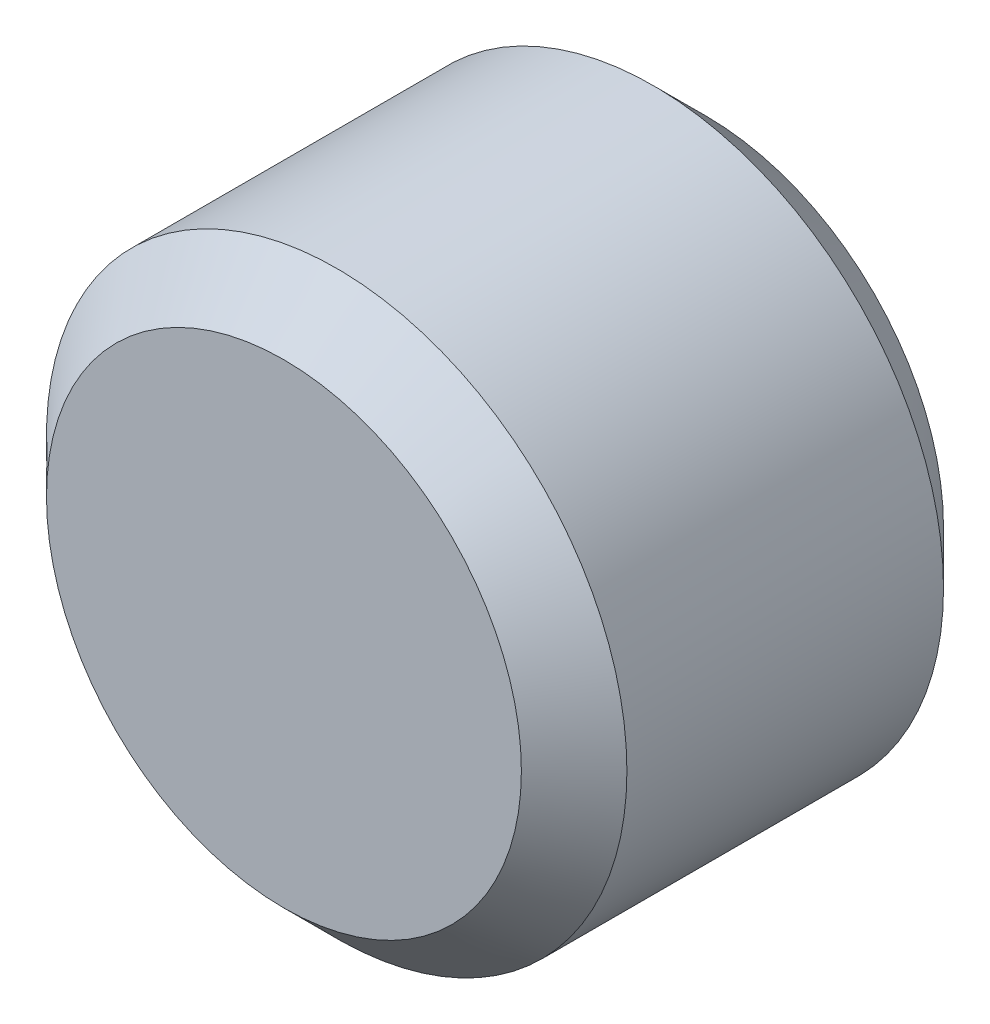
ISO-10303-21;
HEADER;
FILE_DESCRIPTION(('STEP AP214'),'2;1');
FILE_NAME('part.step','',(''),(''),'','','');
FILE_SCHEMA(('AUTOMOTIVE_DESIGN { 1 0 10303 214 1 1 1 1 }'));
ENDSEC;
DATA;
#1=APPLICATION_CONTEXT('core data for automotive mechanical design processes');
#2=APPLICATION_PROTOCOL_DEFINITION('international standard','automotive_design',2000,#1);
#3=PRODUCT_CONTEXT('',#1,'mechanical');
#4=PRODUCT('Part','Part','',(#3));
#5=PRODUCT_RELATED_PRODUCT_CATEGORY('part','',(#4));
#6=PRODUCT_DEFINITION_FORMATION('','',#4);
#7=PRODUCT_DEFINITION_CONTEXT('part definition',#1,'design');
#8=PRODUCT_DEFINITION('design','',#6,#7);
#9=PRODUCT_DEFINITION_SHAPE('','',#8);
#10=(LENGTH_UNIT() NAMED_UNIT(*) SI_UNIT(.MILLI.,.METRE.));
#11=(NAMED_UNIT(*) PLANE_ANGLE_UNIT() SI_UNIT($,.RADIAN.));
#12=(NAMED_UNIT(*) SI_UNIT($,.STERADIAN.) SOLID_ANGLE_UNIT());
#13=UNCERTAINTY_MEASURE_WITH_UNIT(LENGTH_MEASURE(1.E-05),#10,'distance_accuracy_value','');
#14=(GEOMETRIC_REPRESENTATION_CONTEXT(3) GLOBAL_UNCERTAINTY_ASSIGNED_CONTEXT((#13)) GLOBAL_UNIT_ASSIGNED_CONTEXT((#10,
#11,#12)) REPRESENTATION_CONTEXT('',''));
#15=CARTESIAN_POINT('',(0.,0.,0.));
#16=DIRECTION('',(0.,0.,1.));
#17=DIRECTION('',(1.,0.,0.));
#18=AXIS2_PLACEMENT_3D('',#15,#16,#17);
#19=CARTESIAN_POINT('',(0.,0.,1.5));
#20=DIRECTION('',(0.,0.,-1.));
#21=DIRECTION('',(-1.,0.,0.));
#22=AXIS2_PLACEMENT_3D('',#19,#20,#21);
#23=CYLINDRICAL_SURFACE('',#22,2.75);
#24=CARTESIAN_POINT('',(0.,0.,1.));
#25=DIRECTION('',(0.,0.,1.));
#26=DIRECTION('',(1.,0.,0.));
#27=AXIS2_PLACEMENT_3D('',#24,#25,#26);
#28=CIRCLE('',#27,2.75);
#29=CARTESIAN_POINT('',(2.75,0.,1.));
#30=VERTEX_POINT('',#29);
#31=EDGE_CURVE('E38',#30,#30,#28,.F.);
#32=ORIENTED_EDGE('',*,*,#31,.T.);
#33=EDGE_LOOP('',(#32));
#34=FACE_BOUND('',#33,.T.);
#35=CARTESIAN_POINT('',(0.,0.,-2.));
#36=DIRECTION('',(0.,0.,1.));
#37=DIRECTION('',(1.,0.,0.));
#38=AXIS2_PLACEMENT_3D('',#35,#36,#37);
#39=CIRCLE('',#38,2.75);
#40=CARTESIAN_POINT('',(2.75,0.,-2.));
#41=VERTEX_POINT('',#40);
#42=EDGE_CURVE('E42',#41,#41,#39,.T.);
#43=ORIENTED_EDGE('',*,*,#42,.T.);
#44=EDGE_LOOP('',(#43));
#45=FACE_BOUND('',#44,.T.);
#46=ADVANCED_FACE('F31',(#34,#45),#23,.T.);
#47=CARTESIAN_POINT('',(0.,0.,1.5));
#48=DIRECTION('',(0.,0.,1.));
#49=DIRECTION('',(1.,0.,0.));
#50=AXIS2_PLACEMENT_3D('',#47,#48,#49);
#51=PLANE('',#50);
#52=CARTESIAN_POINT('',(0.,0.,1.5));
#53=DIRECTION('',(0.,0.,1.));
#54=DIRECTION('',(1.,0.,0.));
#55=AXIS2_PLACEMENT_3D('',#52,#53,#54);
#56=CIRCLE('',#55,2.25);
#57=CARTESIAN_POINT('',(2.25,0.,1.5));
#58=VERTEX_POINT('',#57);
#59=EDGE_CURVE('E46',#58,#58,#56,.T.);
#60=ORIENTED_EDGE('',*,*,#59,.T.);
#61=EDGE_LOOP('',(#60));
#62=FACE_BOUND('',#61,.T.);
#63=ADVANCED_FACE('F77',(#62),#51,.T.);
#64=CARTESIAN_POINT('',(0.,0.,-2.5));
#65=DIRECTION('',(0.,0.,1.));
#66=DIRECTION('',(1.,0.,0.));
#67=AXIS2_PLACEMENT_3D('',#64,#65,#66);
#68=PLANE('',#67);
#69=CARTESIAN_POINT('',(0.,0.,-2.5));
#70=DIRECTION('',(0.,0.,1.));
#71=DIRECTION('',(1.,0.,0.));
#72=AXIS2_PLACEMENT_3D('',#69,#70,#71);
#73=CIRCLE('',#72,2.25);
#74=CARTESIAN_POINT('',(2.25,0.,-2.5));
#75=VERTEX_POINT('',#74);
#76=EDGE_CURVE('E10',#75,#75,#73,.F.);
#77=ORIENTED_EDGE('',*,*,#76,.T.);
#78=EDGE_LOOP('',(#77));
#79=FACE_BOUND('',#78,.T.);
#80=CARTESIAN_POINT('',(0.,0.,-2.5));
#81=DIRECTION('',(0.,0.,1.));
#82=DIRECTION('',(1.,0.,0.));
#83=AXIS2_PLACEMENT_3D('',#80,#81,#82);
#84=CIRCLE('',#83,1.);
#85=CARTESIAN_POINT('',(1.,0.,-2.5));
#86=VERTEX_POINT('',#85);
#87=EDGE_CURVE('E54',#86,#86,#84,.T.);
#88=ORIENTED_EDGE('',*,*,#87,.T.);
#89=EDGE_LOOP('',(#88));
#90=FACE_BOUND('',#89,.T.);
#91=ADVANCED_FACE('F58',(#79,#90),#68,.F.);
#92=CARTESIAN_POINT('',(0.,0.,-2.5));
#93=DIRECTION('',(0.,0.,1.));
#94=DIRECTION('',(1.,0.,0.));
#95=AXIS2_PLACEMENT_3D('',#92,#93,#94);
#96=CYLINDRICAL_SURFACE('',#95,1.);
#97=ORIENTED_EDGE('',*,*,#87,.F.);
#98=EDGE_LOOP('',(#97));
#99=FACE_BOUND('',#98,.T.);
#100=CARTESIAN_POINT('',(0.,0.,0.));
#101=DIRECTION('',(0.,0.,1.));
#102=DIRECTION('',(1.,0.,0.));
#103=AXIS2_PLACEMENT_3D('',#100,#101,#102);
#104=CIRCLE('',#103,1.);
#105=CARTESIAN_POINT('',(1.,0.,0.));
#106=VERTEX_POINT('',#105);
#107=EDGE_CURVE('E51',#106,#106,#104,.T.);
#108=ORIENTED_EDGE('',*,*,#107,.T.);
#109=EDGE_LOOP('',(#108));
#110=FACE_BOUND('',#109,.T.);
#111=ADVANCED_FACE('F60',(#99,#110),#96,.F.);
#112=CARTESIAN_POINT('',(0.,0.,0.));
#113=DIRECTION('',(0.,0.,1.));
#114=DIRECTION('',(1.,0.,0.));
#115=AXIS2_PLACEMENT_3D('',#112,#113,#114);
#116=PLANE('',#115);
#117=ORIENTED_EDGE('',*,*,#107,.F.);
#118=EDGE_LOOP('',(#117));
#119=FACE_BOUND('',#118,.T.);
#120=ADVANCED_FACE('F63',(#119),#116,.F.);
#121=CARTESIAN_POINT('',(0.,0.,1.5));
#122=DIRECTION('',(0.,0.,-1.));
#123=DIRECTION('',(-1.,0.,0.));
#124=AXIS2_PLACEMENT_3D('',#121,#122,#123);
#125=CONICAL_SURFACE('',#124,2.25,0.785398163397447);
#126=ORIENTED_EDGE('',*,*,#31,.F.);
#127=EDGE_LOOP('',(#126));
#128=FACE_BOUND('',#127,.T.);
#129=ORIENTED_EDGE('',*,*,#59,.F.);
#130=EDGE_LOOP('',(#129));
#131=FACE_BOUND('',#130,.T.);
#132=ADVANCED_FACE('F68',(#128,#131),#125,.T.);
#133=CARTESIAN_POINT('',(0.,0.,-2.));
#134=DIRECTION('',(0.,0.,1.));
#135=DIRECTION('',(1.,0.,0.));
#136=AXIS2_PLACEMENT_3D('',#133,#134,#135);
#137=CONICAL_SURFACE('',#136,2.75,0.785398163397449);
#138=ORIENTED_EDGE('',*,*,#76,.F.);
#139=EDGE_LOOP('',(#138));
#140=FACE_BOUND('',#139,.T.);
#141=ORIENTED_EDGE('',*,*,#42,.F.);
#142=EDGE_LOOP('',(#141));
#143=FACE_BOUND('',#142,.T.);
#144=ADVANCED_FACE('F33',(#140,#143),#137,.T.);
#145=CLOSED_SHELL('',(#46,#63,#91,#111,#120,#132,#144));
#146=MANIFOLD_SOLID_BREP('B2',#145);
#147=ADVANCED_BREP_SHAPE_REPRESENTATION('',(#18,#146),#14);
#148=SHAPE_DEFINITION_REPRESENTATION(#9,#147);
ENDSEC;
END-ISO-10303-21;
